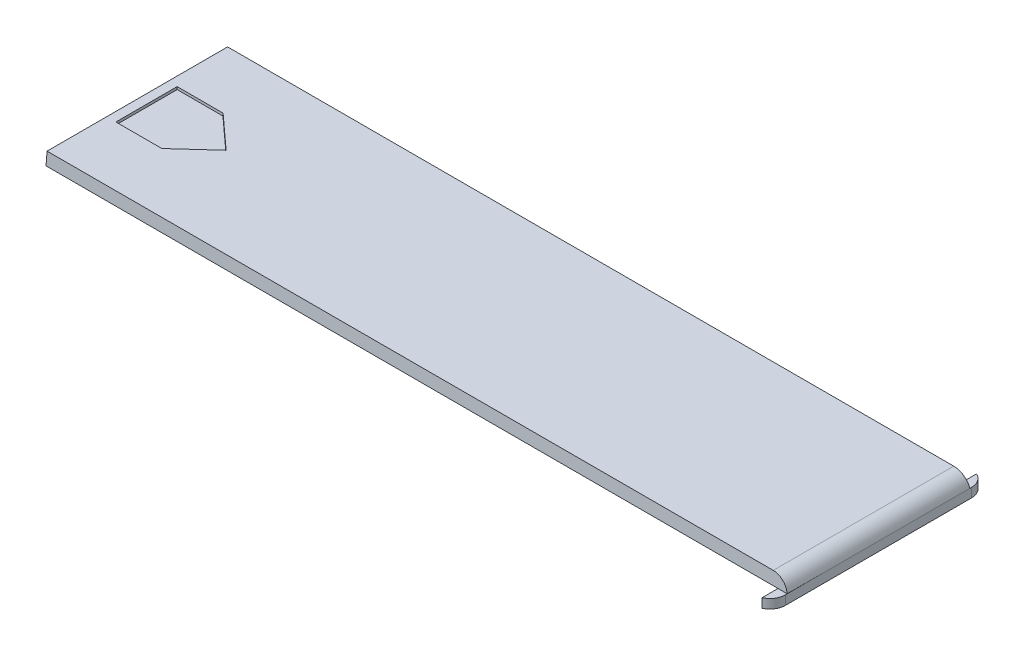
ISO-10303-21;
HEADER;
FILE_DESCRIPTION(('STEP AP214'),'2;1');
FILE_NAME('part.step','',(''),(''),'','','');
FILE_SCHEMA(('AUTOMOTIVE_DESIGN { 1 0 10303 214 1 1 1 1 }'));
ENDSEC;
DATA;
#1=APPLICATION_CONTEXT('core data for automotive mechanical design processes');
#2=APPLICATION_PROTOCOL_DEFINITION('international standard','automotive_design',2000,#1);
#3=PRODUCT_CONTEXT('',#1,'mechanical');
#4=PRODUCT('Part','Part','',(#3));
#5=PRODUCT_RELATED_PRODUCT_CATEGORY('part','',(#4));
#6=PRODUCT_DEFINITION_FORMATION('','',#4);
#7=PRODUCT_DEFINITION_CONTEXT('part definition',#1,'design');
#8=PRODUCT_DEFINITION('design','',#6,#7);
#9=PRODUCT_DEFINITION_SHAPE('','',#8);
#10=(LENGTH_UNIT() NAMED_UNIT(*) SI_UNIT(.MILLI.,.METRE.));
#11=(NAMED_UNIT(*) PLANE_ANGLE_UNIT() SI_UNIT($,.RADIAN.));
#12=(NAMED_UNIT(*) SI_UNIT($,.STERADIAN.) SOLID_ANGLE_UNIT());
#13=UNCERTAINTY_MEASURE_WITH_UNIT(LENGTH_MEASURE(1.E-05),#10,'distance_accuracy_value','');
#14=(GEOMETRIC_REPRESENTATION_CONTEXT(3) GLOBAL_UNCERTAINTY_ASSIGNED_CONTEXT((#13)) GLOBAL_UNIT_ASSIGNED_CONTEXT((#10,
#11,#12)) REPRESENTATION_CONTEXT('',''));
#15=CARTESIAN_POINT('',(0.,0.,0.));
#16=DIRECTION('',(0.,0.,1.));
#17=DIRECTION('',(1.,0.,0.));
#18=AXIS2_PLACEMENT_3D('',#15,#16,#17);
#19=CARTESIAN_POINT('',(0.,0.,0.));
#20=DIRECTION('',(0.,-1.,0.));
#21=DIRECTION('',(0.,0.,-1.));
#22=AXIS2_PLACEMENT_3D('',#19,#20,#21);
#23=PLANE('',#22);
#24=DIRECTION('',(1.,0.,0.));
#25=VECTOR('',#24,1.);
#26=CARTESIAN_POINT('',(-121.75,0.,-11.3497769642847));
#27=LINE('',#26,#25);
#28=CARTESIAN_POINT('',(-121.,0.,-11.3497769642847));
#29=VERTEX_POINT('',#28);
#30=CARTESIAN_POINT('',(-120.25,0.,-11.3497769642847));
#31=VERTEX_POINT('',#30);
#32=EDGE_CURVE('E283',#29,#31,#27,.T.);
#33=ORIENTED_EDGE('',*,*,#32,.T.);
#34=CARTESIAN_POINT('',(-120.25,0.,-12.5997769642847));
#35=DIRECTION('',(0.,1.,0.));
#36=DIRECTION('',(0.,0.,1.));
#37=AXIS2_PLACEMENT_3D('',#34,#35,#36);
#38=CIRCLE('',#37,1.24999999999999);
#39=CARTESIAN_POINT('',(-119.,0.,-12.5997769642847));
#40=VERTEX_POINT('',#39);
#41=EDGE_CURVE('E226',#31,#40,#38,.T.);
#42=ORIENTED_EDGE('',*,*,#41,.T.);
#43=DIRECTION('',(0.,0.,1.));
#44=VECTOR('',#43,1.);
#45=CARTESIAN_POINT('',(-119.,0.,-17.2197769642847));
#46=LINE('',#45,#44);
#47=CARTESIAN_POINT('',(-119.,0.,-17.2197769642847));
#48=VERTEX_POINT('',#47);
#49=EDGE_CURVE('E266',#48,#40,#46,.T.);
#50=ORIENTED_EDGE('',*,*,#49,.F.);
#51=CARTESIAN_POINT('',(-120.25,0.,-17.2197769642847));
#52=DIRECTION('',(0.,1.,0.));
#53=DIRECTION('',(0.,0.,1.));
#54=AXIS2_PLACEMENT_3D('',#51,#52,#53);
#55=CIRCLE('',#54,1.25);
#56=CARTESIAN_POINT('',(-120.25,0.,-18.4697769642847));
#57=VERTEX_POINT('',#56);
#58=EDGE_CURVE('E269',#48,#57,#55,.T.);
#59=ORIENTED_EDGE('',*,*,#58,.T.);
#60=DIRECTION('',(-1.,0.,0.));
#61=VECTOR('',#60,1.);
#62=CARTESIAN_POINT('',(-120.25,0.,-18.4697769642847));
#63=LINE('',#62,#61);
#64=CARTESIAN_POINT('',(-121.,0.,-18.4697769642847));
#65=VERTEX_POINT('',#64);
#66=EDGE_CURVE('E273',#57,#65,#63,.T.);
#67=ORIENTED_EDGE('',*,*,#66,.T.);
#68=DIRECTION('',(0.,0.,1.));
#69=VECTOR('',#68,1.);
#70=CARTESIAN_POINT('',(-121.,0.,-29.8195539285693));
#71=LINE('',#70,#69);
#72=CARTESIAN_POINT('',(-121.,0.,-29.8195539285693));
#73=VERTEX_POINT('',#72);
#74=EDGE_CURVE('E372',#73,#65,#71,.T.);
#75=ORIENTED_EDGE('',*,*,#74,.F.);
#76=DIRECTION('',(1.,0.,0.));
#77=VECTOR('',#76,1.);
#78=CARTESIAN_POINT('',(-121.,0.,-29.8195539285693));
#79=LINE('',#78,#77);
#80=CARTESIAN_POINT('',(-1.5,0.,-29.8195539285693));
#81=VERTEX_POINT('',#80);
#82=EDGE_CURVE('E361',#73,#81,#79,.T.);
#83=ORIENTED_EDGE('',*,*,#82,.T.);
#84=DIRECTION('',(0.,0.,1.));
#85=VECTOR('',#84,1.);
#86=CARTESIAN_POINT('',(-1.5,0.,-32.4097769642847));
#87=LINE('',#86,#85);
#88=CARTESIAN_POINT('',(-1.5,0.,0.));
#89=VERTEX_POINT('',#88);
#90=EDGE_CURVE('E11',#81,#89,#87,.T.);
#91=ORIENTED_EDGE('',*,*,#90,.T.);
#92=DIRECTION('',(1.,0.,0.));
#93=VECTOR('',#92,1.);
#94=CARTESIAN_POINT('',(-121.,0.,0.));
#95=LINE('',#94,#93);
#96=CARTESIAN_POINT('',(-121.,0.,0.));
#97=VERTEX_POINT('',#96);
#98=EDGE_CURVE('E371',#97,#89,#95,.T.);
#99=ORIENTED_EDGE('',*,*,#98,.F.);
#100=EDGE_CURVE('E395',#29,#97,#71,.T.);
#101=ORIENTED_EDGE('',*,*,#100,.F.);
#102=EDGE_LOOP('',(#33,#42,#50,#59,#67,#75,#83,#91,#99,#101));
#103=FACE_BOUND('',#102,.T.);
#104=ADVANCED_FACE('F32',(#103),#23,.T.);
#105=CARTESIAN_POINT('',(-121.,0.,-29.8195539285693));
#106=DIRECTION('',(0.,0.0871557427476584,-0.996194698091746));
#107=DIRECTION('',(0.,0.996194698091746,0.0871557427476584));
#108=AXIS2_PLACEMENT_3D('',#105,#106,#107);
#109=PLANE('',#108);
#110=DIRECTION('',(1.,0.,0.));
#111=VECTOR('',#110,1.);
#112=CARTESIAN_POINT('',(0.,2.,-29.6445766015175));
#113=LINE('',#112,#111);
#114=CARTESIAN_POINT('',(-121.,2.,-29.6445766015175));
#115=VERTEX_POINT('',#114);
#116=CARTESIAN_POINT('',(-2.44948974278318,2.,-29.6445766015175));
#117=VERTEX_POINT('',#116);
#118=EDGE_CURVE('E377',#115,#117,#113,.T.);
#119=ORIENTED_EDGE('',*,*,#118,.T.);
#120=CARTESIAN_POINT('',(-2.44948974278318,-0.5,-29.8632982603323));
#121=DIRECTION('',(0.,0.0871557427476584,-0.996194698091746));
#122=DIRECTION('',(0.,0.996194698091746,0.0871557427476584));
#123=AXIS2_PLACEMENT_3D('',#120,#121,#122);
#124=ELLIPSE('',#123,2.50954959385837,2.5);
#125=CARTESIAN_POINT('',(0.,0.,-29.8195539285693));
#126=VERTEX_POINT('',#125);
#127=EDGE_CURVE('E392',#117,#126,#124,.T.);
#128=ORIENTED_EDGE('',*,*,#127,.T.);
#129=EDGE_CURVE('E359',#81,#126,#79,.T.);
#130=ORIENTED_EDGE('',*,*,#129,.F.);
#131=ORIENTED_EDGE('',*,*,#82,.F.);
#132=DIRECTION('',(0.,-0.996194698091746,-0.0871557427476584));
#133=VECTOR('',#132,1.);
#134=CARTESIAN_POINT('',(-121.,0.,-29.8195539285693));
#135=LINE('',#134,#133);
#136=EDGE_CURVE('E382',#115,#73,#135,.T.);
#137=ORIENTED_EDGE('',*,*,#136,.F.);
#138=EDGE_LOOP('',(#119,#128,#130,#131,#137));
#139=FACE_BOUND('',#138,.T.);
#140=ADVANCED_FACE('F410',(#139),#109,.T.);
#141=CARTESIAN_POINT('',(-121.,2.,-29.8195539285693));
#142=DIRECTION('',(1.,0.,0.));
#143=DIRECTION('',(0.,0.,-1.));
#144=AXIS2_PLACEMENT_3D('',#141,#142,#143);
#145=PLANE('',#144);
#146=ORIENTED_EDGE('',*,*,#74,.T.);
#147=EDGE_CURVE('E565',#65,#29,#71,.T.);
#148=ORIENTED_EDGE('',*,*,#147,.T.);
#149=ORIENTED_EDGE('',*,*,#100,.T.);
#150=DIRECTION('',(0.,0.996194698091746,-0.0871557427476584));
#151=VECTOR('',#150,1.);
#152=CARTESIAN_POINT('',(-121.,0.,0.));
#153=LINE('',#152,#151);
#154=CARTESIAN_POINT('',(-121.,2.,-0.174977327051847));
#155=VERTEX_POINT('',#154);
#156=EDGE_CURVE('E379',#155,#97,#153,.F.);
#157=ORIENTED_EDGE('',*,*,#156,.F.);
#158=DIRECTION('',(0.,0.,1.));
#159=VECTOR('',#158,1.);
#160=CARTESIAN_POINT('',(-121.,2.,-29.8195539285693));
#161=LINE('',#160,#159);
#162=EDGE_CURVE('E386',#115,#155,#161,.T.);
#163=ORIENTED_EDGE('',*,*,#162,.F.);
#164=ORIENTED_EDGE('',*,*,#136,.T.);
#165=EDGE_LOOP('',(#146,#148,#149,#157,#163,#164));
#166=FACE_BOUND('',#165,.T.);
#167=ADVANCED_FACE('F403',(#166),#145,.F.);
#168=CARTESIAN_POINT('',(-121.,0.,0.));
#169=DIRECTION('',(0.,0.0871557427476584,0.996194698091746));
#170=DIRECTION('',(0.,-0.996194698091746,0.0871557427476584));
#171=AXIS2_PLACEMENT_3D('',#168,#169,#170);
#172=PLANE('',#171);
#173=ORIENTED_EDGE('',*,*,#98,.T.);
#174=CARTESIAN_POINT('',(0.,0.,0.));
#175=VERTEX_POINT('',#174);
#176=EDGE_CURVE('E369',#89,#175,#95,.T.);
#177=ORIENTED_EDGE('',*,*,#176,.T.);
#178=CARTESIAN_POINT('',(-2.44948974278318,-0.5,0.0437443317629621));
#179=DIRECTION('',(0.,0.0871557427476584,0.996194698091746));
#180=DIRECTION('',(0.,-0.996194698091746,0.0871557427476584));
#181=AXIS2_PLACEMENT_3D('',#178,#179,#180);
#182=ELLIPSE('',#181,2.50954959385837,2.5);
#183=CARTESIAN_POINT('',(-2.44948974278318,2.,-0.174977327051848));
#184=VERTEX_POINT('',#183);
#185=EDGE_CURVE('E41',#175,#184,#182,.T.);
#186=ORIENTED_EDGE('',*,*,#185,.T.);
#187=DIRECTION('',(-1.,0.,0.));
#188=VECTOR('',#187,1.);
#189=CARTESIAN_POINT('',(0.,2.,-0.174977327051848));
#190=LINE('',#189,#188);
#191=EDGE_CURVE('E383',#155,#184,#190,.F.);
#192=ORIENTED_EDGE('',*,*,#191,.F.);
#193=ORIENTED_EDGE('',*,*,#156,.T.);
#194=EDGE_LOOP('',(#173,#177,#186,#192,#193));
#195=FACE_BOUND('',#194,.T.);
#196=ADVANCED_FACE('F408',(#195),#172,.T.);
#197=CARTESIAN_POINT('',(0.,2.,0.));
#198=DIRECTION('',(0.,-1.,0.));
#199=DIRECTION('',(0.,0.,-1.));
#200=AXIS2_PLACEMENT_3D('',#197,#198,#199);
#201=PLANE('',#200);
#202=DIRECTION('',(-1.,0.,0.));
#203=VECTOR('',#202,1.);
#204=CARTESIAN_POINT('',(-112.,1.99999999999924,-19.9097769642847));
#205=LINE('',#204,#203);
#206=CARTESIAN_POINT('',(-112.,2.,-19.9097769642847));
#207=VERTEX_POINT('',#206);
#208=CARTESIAN_POINT('',(-119.5,1.99999999999924,-19.9097769642847));
#209=VERTEX_POINT('',#208);
#210=EDGE_CURVE('E207',#207,#209,#205,.T.);
#211=ORIENTED_EDGE('',*,*,#210,.F.);
#212=DIRECTION('',(-0.739940073395944,0.,-0.672672793996313));
#213=VECTOR('',#212,1.);
#214=CARTESIAN_POINT('',(-106.5,1.99999999999924,-14.9097769642847));
#215=LINE('',#214,#213);
#216=CARTESIAN_POINT('',(-106.5,1.99999999999924,-14.9097769642847));
#217=VERTEX_POINT('',#216);
#218=EDGE_CURVE('E51',#217,#207,#215,.T.);
#219=ORIENTED_EDGE('',*,*,#218,.F.);
#220=DIRECTION('',(0.739940073395944,0.,-0.672672793996313));
#221=VECTOR('',#220,1.);
#222=CARTESIAN_POINT('',(-112.,1.99999999999924,-9.90977696428465));
#223=LINE('',#222,#221);
#224=CARTESIAN_POINT('',(-112.,1.99999999999924,-9.90977696428465));
#225=VERTEX_POINT('',#224);
#226=EDGE_CURVE('E217',#225,#217,#223,.T.);
#227=ORIENTED_EDGE('',*,*,#226,.F.);
#228=DIRECTION('',(1.,0.,0.));
#229=VECTOR('',#228,1.);
#230=CARTESIAN_POINT('',(-119.5,1.99999999999924,-9.90977696428465));
#231=LINE('',#230,#229);
#232=CARTESIAN_POINT('',(-119.5,1.99999999999924,-9.90977696428465));
#233=VERTEX_POINT('',#232);
#234=EDGE_CURVE('E215',#233,#225,#231,.T.);
#235=ORIENTED_EDGE('',*,*,#234,.F.);
#236=DIRECTION('',(0.,0.,-1.));
#237=VECTOR('',#236,1.);
#238=CARTESIAN_POINT('',(-119.5,1.99999999999924,-9.90977696428465));
#239=LINE('',#238,#237);
#240=EDGE_CURVE('E196',#233,#209,#239,.T.);
#241=ORIENTED_EDGE('',*,*,#240,.T.);
#242=EDGE_LOOP('',(#211,#219,#227,#235,#241));
#243=FACE_BOUND('',#242,.T.);
#244=ORIENTED_EDGE('',*,*,#191,.T.);
#245=DIRECTION('',(0.,0.,1.));
#246=VECTOR('',#245,1.);
#247=CARTESIAN_POINT('',(-2.44948974278318,2.,0.));
#248=LINE('',#247,#246);
#249=EDGE_CURVE('E390',#184,#117,#248,.F.);
#250=ORIENTED_EDGE('',*,*,#249,.T.);
#251=ORIENTED_EDGE('',*,*,#118,.F.);
#252=ORIENTED_EDGE('',*,*,#162,.T.);
#253=EDGE_LOOP('',(#244,#250,#251,#252));
#254=FACE_BOUND('',#253,.T.);
#255=ADVANCED_FACE('F211',(#243,#254),#201,.F.);
#256=CARTESIAN_POINT('',(-2.44948974278318,-0.5,0.));
#257=DIRECTION('',(0.,0.,1.));
#258=DIRECTION('',(1.,0.,0.));
#259=AXIS2_PLACEMENT_3D('',#256,#257,#258);
#260=CYLINDRICAL_SURFACE('',#259,2.5);
#261=ORIENTED_EDGE('',*,*,#185,.F.);
#262=DIRECTION('',(0.,0.,-1.));
#263=VECTOR('',#262,1.);
#264=CARTESIAN_POINT('',(0.,0.,0.));
#265=LINE('',#264,#263);
#266=EDGE_CURVE('E330',#175,#126,#265,.T.);
#267=ORIENTED_EDGE('',*,*,#266,.T.);
#268=ORIENTED_EDGE('',*,*,#127,.F.);
#269=ORIENTED_EDGE('',*,*,#249,.F.);
#270=EDGE_LOOP('',(#261,#267,#268,#269));
#271=FACE_BOUND('',#270,.T.);
#272=ADVANCED_FACE('F34',(#271),#260,.T.);
#273=CARTESIAN_POINT('',(-2.5,0.,-30.1184891168067));
#274=DIRECTION('',(0.,-1.,0.));
#275=DIRECTION('',(0.,0.,-1.));
#276=AXIS2_PLACEMENT_3D('',#273,#274,#275);
#277=PLANE('',#276);
#278=CARTESIAN_POINT('',(-1.5,0.,-32.4097769642847));
#279=VERTEX_POINT('',#278);
#280=EDGE_CURVE('E43',#279,#81,#87,.T.);
#281=ORIENTED_EDGE('',*,*,#280,.T.);
#282=ORIENTED_EDGE('',*,*,#129,.T.);
#283=DIRECTION('',(0.,0.,-1.));
#284=VECTOR('',#283,1.);
#285=CARTESIAN_POINT('',(0.,0.,0.298935188237424));
#286=LINE('',#285,#284);
#287=CARTESIAN_POINT('',(0.,0.,-30.1184891168067));
#288=VERTEX_POINT('',#287);
#289=EDGE_CURVE('E316',#126,#288,#286,.T.);
#290=ORIENTED_EDGE('',*,*,#289,.T.);
#291=CARTESIAN_POINT('',(-2.5,0.,-30.1184891168067));
#292=DIRECTION('',(0.,-1.,0.));
#293=DIRECTION('',(0.,0.,-1.));
#294=AXIS2_PLACEMENT_3D('',#291,#292,#293);
#295=CIRCLE('',#294,2.5);
#296=EDGE_CURVE('E287',#279,#288,#295,.T.);
#297=ORIENTED_EDGE('',*,*,#296,.F.);
#298=EDGE_LOOP('',(#281,#282,#290,#297));
#299=FACE_BOUND('',#298,.T.);
#300=ADVANCED_FACE('F413',(#299),#277,.F.);
#301=CARTESIAN_POINT('',(-2.5,-1.5,-30.1184891168067));
#302=DIRECTION('',(0.,1.,0.));
#303=DIRECTION('',(0.,0.,1.));
#304=AXIS2_PLACEMENT_3D('',#301,#302,#303);
#305=CYLINDRICAL_SURFACE('',#304,2.5);
#306=ORIENTED_EDGE('',*,*,#296,.T.);
#307=DIRECTION('',(0.,1.,0.));
#308=VECTOR('',#307,1.);
#309=CARTESIAN_POINT('',(0.,-1.5,-30.1184891168067));
#310=LINE('',#309,#308);
#311=CARTESIAN_POINT('',(0.,-1.5,-30.1184891168067));
#312=VERTEX_POINT('',#311);
#313=EDGE_CURVE('E327',#312,#288,#310,.T.);
#314=ORIENTED_EDGE('',*,*,#313,.F.);
#315=CARTESIAN_POINT('',(-2.5,-1.5,-30.1184891168067));
#316=DIRECTION('',(0.,-1.,0.));
#317=DIRECTION('',(0.,0.,-1.));
#318=AXIS2_PLACEMENT_3D('',#315,#316,#317);
#319=CIRCLE('',#318,2.5);
#320=CARTESIAN_POINT('',(-1.5,-1.5,-32.4097769642847));
#321=VERTEX_POINT('',#320);
#322=EDGE_CURVE('E303',#321,#312,#319,.T.);
#323=ORIENTED_EDGE('',*,*,#322,.F.);
#324=DIRECTION('',(0.,1.,0.));
#325=VECTOR('',#324,1.);
#326=CARTESIAN_POINT('',(-1.5,-1.5,-32.4097769642847));
#327=LINE('',#326,#325);
#328=EDGE_CURVE('E313',#321,#279,#327,.T.);
#329=ORIENTED_EDGE('',*,*,#328,.T.);
#330=EDGE_LOOP('',(#306,#314,#323,#329));
#331=FACE_BOUND('',#330,.T.);
#332=ADVANCED_FACE('F418',(#331),#305,.T.);
#333=CARTESIAN_POINT('',(0.,-1.5,0.298935188237424));
#334=DIRECTION('',(1.,0.,0.));
#335=DIRECTION('',(0.,0.,-1.));
#336=AXIS2_PLACEMENT_3D('',#333,#334,#335);
#337=PLANE('',#336);
#338=CARTESIAN_POINT('',(0.,0.,0.298935188237424));
#339=VERTEX_POINT('',#338);
#340=EDGE_CURVE('E324',#339,#175,#286,.T.);
#341=ORIENTED_EDGE('',*,*,#340,.F.);
#342=DIRECTION('',(0.,1.,0.));
#343=VECTOR('',#342,1.);
#344=CARTESIAN_POINT('',(0.,-1.5,0.298935188237424));
#345=LINE('',#344,#343);
#346=CARTESIAN_POINT('',(0.,-1.5,0.298935188237424));
#347=VERTEX_POINT('',#346);
#348=EDGE_CURVE('E331',#347,#339,#345,.T.);
#349=ORIENTED_EDGE('',*,*,#348,.F.);
#350=DIRECTION('',(0.,0.,-1.));
#351=VECTOR('',#350,1.);
#352=CARTESIAN_POINT('',(0.,-1.5,0.298935188237424));
#353=LINE('',#352,#351);
#354=EDGE_CURVE('E305',#347,#312,#353,.T.);
#355=ORIENTED_EDGE('',*,*,#354,.T.);
#356=ORIENTED_EDGE('',*,*,#313,.T.);
#357=ORIENTED_EDGE('',*,*,#289,.F.);
#358=ORIENTED_EDGE('',*,*,#266,.F.);
#359=EDGE_LOOP('',(#341,#349,#355,#356,#357,#358));
#360=FACE_BOUND('',#359,.T.);
#361=ADVANCED_FACE('F353',(#360),#337,.T.);
#362=CARTESIAN_POINT('',(-2.50000000000001,-1.5,0.298935188237422));
#363=DIRECTION('',(0.,1.,0.));
#364=DIRECTION('',(0.,0.,1.));
#365=AXIS2_PLACEMENT_3D('',#362,#363,#364);
#366=CYLINDRICAL_SURFACE('',#365,2.5);
#367=CARTESIAN_POINT('',(-2.50000000000001,0.,0.298935188237422));
#368=DIRECTION('',(0.,-1.,0.));
#369=DIRECTION('',(0.,0.,-1.));
#370=AXIS2_PLACEMENT_3D('',#367,#368,#369);
#371=CIRCLE('',#370,2.5);
#372=CARTESIAN_POINT('',(-1.50000000000001,0.,2.59022303571534));
#373=VERTEX_POINT('',#372);
#374=EDGE_CURVE('E319',#339,#373,#371,.T.);
#375=ORIENTED_EDGE('',*,*,#374,.T.);
#376=DIRECTION('',(0.,1.,0.));
#377=VECTOR('',#376,1.);
#378=CARTESIAN_POINT('',(-1.50000000000001,-1.5,2.59022303571534));
#379=LINE('',#378,#377);
#380=CARTESIAN_POINT('',(-1.50000000000001,-1.5,2.59022303571534));
#381=VERTEX_POINT('',#380);
#382=EDGE_CURVE('E333',#381,#373,#379,.T.);
#383=ORIENTED_EDGE('',*,*,#382,.F.);
#384=CARTESIAN_POINT('',(-2.50000000000001,-1.5,0.298935188237422));
#385=DIRECTION('',(0.,-1.,0.));
#386=DIRECTION('',(0.,0.,-1.));
#387=AXIS2_PLACEMENT_3D('',#384,#385,#386);
#388=CIRCLE('',#387,2.5);
#389=EDGE_CURVE('E308',#347,#381,#388,.T.);
#390=ORIENTED_EDGE('',*,*,#389,.F.);
#391=ORIENTED_EDGE('',*,*,#348,.T.);
#392=EDGE_LOOP('',(#375,#383,#390,#391));
#393=FACE_BOUND('',#392,.T.);
#394=ADVANCED_FACE('F347',(#393),#366,.T.);
#395=CARTESIAN_POINT('',(-1.5,-1.5,-32.4097769642847));
#396=DIRECTION('',(-1.,0.,0.));
#397=DIRECTION('',(0.,0.,1.));
#398=AXIS2_PLACEMENT_3D('',#395,#396,#397);
#399=PLANE('',#398);
#400=ORIENTED_EDGE('',*,*,#280,.F.);
#401=ORIENTED_EDGE('',*,*,#328,.F.);
#402=DIRECTION('',(0.,0.,1.));
#403=VECTOR('',#402,1.);
#404=CARTESIAN_POINT('',(-1.5,-1.5,-32.4097769642847));
#405=LINE('',#404,#403);
#406=EDGE_CURVE('E310',#321,#381,#405,.T.);
#407=ORIENTED_EDGE('',*,*,#406,.T.);
#408=ORIENTED_EDGE('',*,*,#382,.T.);
#409=EDGE_CURVE('E44',#89,#373,#87,.T.);
#410=ORIENTED_EDGE('',*,*,#409,.F.);
#411=ORIENTED_EDGE('',*,*,#90,.F.);
#412=EDGE_LOOP('',(#400,#401,#407,#408,#410,#411));
#413=FACE_BOUND('',#412,.T.);
#414=ADVANCED_FACE('F548',(#413),#399,.T.);
#415=CARTESIAN_POINT('',(-2.5,-1.5,-30.1184891168067));
#416=DIRECTION('',(0.,-1.,0.));
#417=DIRECTION('',(0.,0.,-1.));
#418=AXIS2_PLACEMENT_3D('',#415,#416,#417);
#419=PLANE('',#418);
#420=ORIENTED_EDGE('',*,*,#322,.T.);
#421=ORIENTED_EDGE('',*,*,#354,.F.);
#422=ORIENTED_EDGE('',*,*,#389,.T.);
#423=ORIENTED_EDGE('',*,*,#406,.F.);
#424=EDGE_LOOP('',(#420,#421,#422,#423));
#425=FACE_BOUND('',#424,.T.);
#426=ADVANCED_FACE('F546',(#425),#419,.T.);
#427=ORIENTED_EDGE('',*,*,#176,.F.);
#428=ORIENTED_EDGE('',*,*,#409,.T.);
#429=ORIENTED_EDGE('',*,*,#374,.F.);
#430=ORIENTED_EDGE('',*,*,#340,.T.);
#431=EDGE_LOOP('',(#427,#428,#429,#430));
#432=FACE_BOUND('',#431,.T.);
#433=ADVANCED_FACE('F350',(#432),#277,.F.);
#434=CARTESIAN_POINT('',(-120.25,0.,-12.5997769642847));
#435=DIRECTION('',(0.,1.,0.));
#436=DIRECTION('',(0.,0.,1.));
#437=AXIS2_PLACEMENT_3D('',#434,#435,#436);
#438=PLANE('',#437);
#439=ORIENTED_EDGE('',*,*,#147,.F.);
#440=CARTESIAN_POINT('',(-121.75,0.,-18.4697769642847));
#441=VERTEX_POINT('',#440);
#442=EDGE_CURVE('E272',#65,#441,#63,.T.);
#443=ORIENTED_EDGE('',*,*,#442,.T.);
#444=CARTESIAN_POINT('',(-121.75,0.,-17.2197769642847));
#445=DIRECTION('',(0.,-1.,0.));
#446=DIRECTION('',(0.,0.,-1.));
#447=AXIS2_PLACEMENT_3D('',#444,#445,#446);
#448=CIRCLE('',#447,1.25);
#449=CARTESIAN_POINT('',(-123.,0.,-17.2197769642847));
#450=VERTEX_POINT('',#449);
#451=EDGE_CURVE('E276',#450,#441,#448,.T.);
#452=ORIENTED_EDGE('',*,*,#451,.F.);
#453=DIRECTION('',(0.,0.,-1.));
#454=VECTOR('',#453,1.);
#455=CARTESIAN_POINT('',(-123.,0.,-12.5997769642847));
#456=LINE('',#455,#454);
#457=CARTESIAN_POINT('',(-123.,0.,-12.5997769642847));
#458=VERTEX_POINT('',#457);
#459=EDGE_CURVE('E279',#458,#450,#456,.T.);
#460=ORIENTED_EDGE('',*,*,#459,.F.);
#461=CARTESIAN_POINT('',(-121.75,0.,-12.5997769642847));
#462=DIRECTION('',(0.,1.,0.));
#463=DIRECTION('',(0.,0.,1.));
#464=AXIS2_PLACEMENT_3D('',#461,#462,#463);
#465=CIRCLE('',#464,1.25);
#466=CARTESIAN_POINT('',(-121.75,0.,-11.3497769642847));
#467=VERTEX_POINT('',#466);
#468=EDGE_CURVE('E281',#458,#467,#465,.T.);
#469=ORIENTED_EDGE('',*,*,#468,.T.);
#470=EDGE_CURVE('E59',#467,#29,#27,.T.);
#471=ORIENTED_EDGE('',*,*,#470,.T.);
#472=EDGE_LOOP('',(#439,#443,#452,#460,#469,#471));
#473=FACE_BOUND('',#472,.T.);
#474=ADVANCED_FACE('F512',(#473),#438,.T.);
#475=CARTESIAN_POINT('',(-120.25,-2.,-12.5997769642847));
#476=DIRECTION('',(0.,1.,0.));
#477=DIRECTION('',(0.,0.,1.));
#478=AXIS2_PLACEMENT_3D('',#475,#476,#477);
#479=CYLINDRICAL_SURFACE('',#478,1.24999999999999);
#480=ORIENTED_EDGE('',*,*,#41,.F.);
#481=DIRECTION('',(0.,1.,0.));
#482=VECTOR('',#481,1.);
#483=CARTESIAN_POINT('',(-120.25,-2.,-11.3497769642847));
#484=LINE('',#483,#482);
#485=CARTESIAN_POINT('',(-120.25,-2.,-11.3497769642847));
#486=VERTEX_POINT('',#485);
#487=EDGE_CURVE('E285',#486,#31,#484,.T.);
#488=ORIENTED_EDGE('',*,*,#487,.F.);
#489=CARTESIAN_POINT('',(-120.25,-2.,-12.5997769642847));
#490=DIRECTION('',(0.,1.,0.));
#491=DIRECTION('',(0.,0.,1.));
#492=AXIS2_PLACEMENT_3D('',#489,#490,#491);
#493=CIRCLE('',#492,1.24999999999999);
#494=CARTESIAN_POINT('',(-119.,-2.,-12.5997769642847));
#495=VERTEX_POINT('',#494);
#496=EDGE_CURVE('E242',#486,#495,#493,.T.);
#497=ORIENTED_EDGE('',*,*,#496,.T.);
#498=DIRECTION('',(0.,1.,0.));
#499=VECTOR('',#498,1.);
#500=CARTESIAN_POINT('',(-119.,-2.,-12.5997769642847));
#501=LINE('',#500,#499);
#502=EDGE_CURVE('E263',#495,#40,#501,.T.);
#503=ORIENTED_EDGE('',*,*,#502,.T.);
#504=EDGE_LOOP('',(#480,#488,#497,#503));
#505=FACE_BOUND('',#504,.T.);
#506=ADVANCED_FACE('F515',(#505),#479,.T.);
#507=CARTESIAN_POINT('',(-121.75,-2.,-11.3497769642847));
#508=DIRECTION('',(0.,0.,1.));
#509=DIRECTION('',(1.,0.,0.));
#510=AXIS2_PLACEMENT_3D('',#507,#508,#509);
#511=PLANE('',#510);
#512=ORIENTED_EDGE('',*,*,#470,.F.);
#513=DIRECTION('',(0.,1.,0.));
#514=VECTOR('',#513,1.);
#515=CARTESIAN_POINT('',(-121.75,-2.,-11.3497769642847));
#516=LINE('',#515,#514);
#517=CARTESIAN_POINT('',(-121.75,-2.,-11.3497769642847));
#518=VERTEX_POINT('',#517);
#519=EDGE_CURVE('E288',#518,#467,#516,.T.);
#520=ORIENTED_EDGE('',*,*,#519,.F.);
#521=DIRECTION('',(1.,0.,0.));
#522=VECTOR('',#521,1.);
#523=CARTESIAN_POINT('',(-121.75,-2.,-11.3497769642847));
#524=LINE('',#523,#522);
#525=EDGE_CURVE('E260',#518,#486,#524,.T.);
#526=ORIENTED_EDGE('',*,*,#525,.T.);
#527=ORIENTED_EDGE('',*,*,#487,.T.);
#528=ORIENTED_EDGE('',*,*,#32,.F.);
#529=EDGE_LOOP('',(#512,#520,#526,#527,#528));
#530=FACE_BOUND('',#529,.T.);
#531=ADVANCED_FACE('F516',(#530),#511,.T.);
#532=CARTESIAN_POINT('',(-121.75,-2.,-12.5997769642847));
#533=DIRECTION('',(0.,1.,0.));
#534=DIRECTION('',(0.,0.,1.));
#535=AXIS2_PLACEMENT_3D('',#532,#533,#534);
#536=CYLINDRICAL_SURFACE('',#535,1.25);
#537=ORIENTED_EDGE('',*,*,#468,.F.);
#538=DIRECTION('',(0.,1.,0.));
#539=VECTOR('',#538,1.);
#540=CARTESIAN_POINT('',(-123.,-2.,-12.5997769642847));
#541=LINE('',#540,#539);
#542=CARTESIAN_POINT('',(-123.,-2.,-12.5997769642847));
#543=VERTEX_POINT('',#542);
#544=EDGE_CURVE('E290',#543,#458,#541,.T.);
#545=ORIENTED_EDGE('',*,*,#544,.F.);
#546=CARTESIAN_POINT('',(-121.75,-2.,-12.5997769642847));
#547=DIRECTION('',(0.,1.,0.));
#548=DIRECTION('',(0.,0.,1.));
#549=AXIS2_PLACEMENT_3D('',#546,#547,#548);
#550=CIRCLE('',#549,1.25);
#551=EDGE_CURVE('E257',#543,#518,#550,.T.);
#552=ORIENTED_EDGE('',*,*,#551,.T.);
#553=ORIENTED_EDGE('',*,*,#519,.T.);
#554=EDGE_LOOP('',(#537,#545,#552,#553));
#555=FACE_BOUND('',#554,.T.);
#556=ADVANCED_FACE('F519',(#555),#536,.T.);
#557=CARTESIAN_POINT('',(-123.,-2.,-12.5997769642847));
#558=DIRECTION('',(1.,0.,0.));
#559=DIRECTION('',(0.,0.,-1.));
#560=AXIS2_PLACEMENT_3D('',#557,#558,#559);
#561=PLANE('',#560);
#562=ORIENTED_EDGE('',*,*,#459,.T.);
#563=DIRECTION('',(0.,1.,0.));
#564=VECTOR('',#563,1.);
#565=CARTESIAN_POINT('',(-123.,-2.,-17.2197769642847));
#566=LINE('',#565,#564);
#567=CARTESIAN_POINT('',(-123.,-2.,-17.2197769642847));
#568=VERTEX_POINT('',#567);
#569=EDGE_CURVE('E292',#568,#450,#566,.T.);
#570=ORIENTED_EDGE('',*,*,#569,.F.);
#571=DIRECTION('',(0.,0.,-1.));
#572=VECTOR('',#571,1.);
#573=CARTESIAN_POINT('',(-123.,-2.,-12.5997769642847));
#574=LINE('',#573,#572);
#575=EDGE_CURVE('E255',#543,#568,#574,.T.);
#576=ORIENTED_EDGE('',*,*,#575,.F.);
#577=ORIENTED_EDGE('',*,*,#544,.T.);
#578=EDGE_LOOP('',(#562,#570,#576,#577));
#579=FACE_BOUND('',#578,.T.);
#580=ADVANCED_FACE('F523',(#579),#561,.F.);
#581=CARTESIAN_POINT('',(-121.75,-2.,-17.2197769642847));
#582=DIRECTION('',(0.,1.,0.));
#583=DIRECTION('',(0.,0.,1.));
#584=AXIS2_PLACEMENT_3D('',#581,#582,#583);
#585=CYLINDRICAL_SURFACE('',#584,1.25);
#586=ORIENTED_EDGE('',*,*,#451,.T.);
#587=DIRECTION('',(0.,1.,0.));
#588=VECTOR('',#587,1.);
#589=CARTESIAN_POINT('',(-121.75,-2.,-18.4697769642847));
#590=LINE('',#589,#588);
#591=CARTESIAN_POINT('',(-121.75,-2.,-18.4697769642847));
#592=VERTEX_POINT('',#591);
#593=EDGE_CURVE('E295',#592,#441,#590,.T.);
#594=ORIENTED_EDGE('',*,*,#593,.F.);
#595=CARTESIAN_POINT('',(-121.75,-2.,-17.2197769642847));
#596=DIRECTION('',(0.,-1.,0.));
#597=DIRECTION('',(0.,0.,-1.));
#598=AXIS2_PLACEMENT_3D('',#595,#596,#597);
#599=CIRCLE('',#598,1.25);
#600=EDGE_CURVE('E253',#568,#592,#599,.T.);
#601=ORIENTED_EDGE('',*,*,#600,.F.);
#602=ORIENTED_EDGE('',*,*,#569,.T.);
#603=EDGE_LOOP('',(#586,#594,#601,#602));
#604=FACE_BOUND('',#603,.T.);
#605=ADVANCED_FACE('F527',(#604),#585,.T.);
#606=CARTESIAN_POINT('',(-120.25,-2.,-18.4697769642847));
#607=DIRECTION('',(0.,0.,-1.));
#608=DIRECTION('',(-1.,0.,0.));
#609=AXIS2_PLACEMENT_3D('',#606,#607,#608);
#610=PLANE('',#609);
#611=ORIENTED_EDGE('',*,*,#66,.F.);
#612=DIRECTION('',(0.,1.,0.));
#613=VECTOR('',#612,1.);
#614=CARTESIAN_POINT('',(-120.25,-2.,-18.4697769642847));
#615=LINE('',#614,#613);
#616=CARTESIAN_POINT('',(-120.25,-2.,-18.4697769642847));
#617=VERTEX_POINT('',#616);
#618=EDGE_CURVE('E298',#617,#57,#615,.T.);
#619=ORIENTED_EDGE('',*,*,#618,.F.);
#620=DIRECTION('',(-1.,0.,0.));
#621=VECTOR('',#620,1.);
#622=CARTESIAN_POINT('',(-120.25,-2.,-18.4697769642847));
#623=LINE('',#622,#621);
#624=EDGE_CURVE('E250',#617,#592,#623,.T.);
#625=ORIENTED_EDGE('',*,*,#624,.T.);
#626=ORIENTED_EDGE('',*,*,#593,.T.);
#627=ORIENTED_EDGE('',*,*,#442,.F.);
#628=EDGE_LOOP('',(#611,#619,#625,#626,#627));
#629=FACE_BOUND('',#628,.T.);
#630=ADVANCED_FACE('F531',(#629),#610,.T.);
#631=CARTESIAN_POINT('',(-120.25,-2.,-17.2197769642847));
#632=DIRECTION('',(0.,1.,0.));
#633=DIRECTION('',(0.,0.,1.));
#634=AXIS2_PLACEMENT_3D('',#631,#632,#633);
#635=CYLINDRICAL_SURFACE('',#634,1.25);
#636=ORIENTED_EDGE('',*,*,#58,.F.);
#637=DIRECTION('',(0.,1.,0.));
#638=VECTOR('',#637,1.);
#639=CARTESIAN_POINT('',(-119.,-2.,-17.2197769642847));
#640=LINE('',#639,#638);
#641=CARTESIAN_POINT('',(-119.,-2.,-17.2197769642847));
#642=VERTEX_POINT('',#641);
#643=EDGE_CURVE('E300',#642,#48,#640,.T.);
#644=ORIENTED_EDGE('',*,*,#643,.F.);
#645=CARTESIAN_POINT('',(-120.25,-2.,-17.2197769642847));
#646=DIRECTION('',(0.,1.,0.));
#647=DIRECTION('',(0.,0.,1.));
#648=AXIS2_PLACEMENT_3D('',#645,#646,#647);
#649=CIRCLE('',#648,1.25);
#650=EDGE_CURVE('E247',#642,#617,#649,.T.);
#651=ORIENTED_EDGE('',*,*,#650,.T.);
#652=ORIENTED_EDGE('',*,*,#618,.T.);
#653=EDGE_LOOP('',(#636,#644,#651,#652));
#654=FACE_BOUND('',#653,.T.);
#655=ADVANCED_FACE('F535',(#654),#635,.T.);
#656=CARTESIAN_POINT('',(-119.,-2.,-17.2197769642847));
#657=DIRECTION('',(-1.,0.,0.));
#658=DIRECTION('',(0.,0.,1.));
#659=AXIS2_PLACEMENT_3D('',#656,#657,#658);
#660=PLANE('',#659);
#661=ORIENTED_EDGE('',*,*,#49,.T.);
#662=ORIENTED_EDGE('',*,*,#502,.F.);
#663=DIRECTION('',(0.,0.,1.));
#664=VECTOR('',#663,1.);
#665=CARTESIAN_POINT('',(-119.,-2.,-17.2197769642847));
#666=LINE('',#665,#664);
#667=EDGE_CURVE('E245',#642,#495,#666,.T.);
#668=ORIENTED_EDGE('',*,*,#667,.F.);
#669=ORIENTED_EDGE('',*,*,#643,.T.);
#670=EDGE_LOOP('',(#661,#662,#668,#669));
#671=FACE_BOUND('',#670,.T.);
#672=ADVANCED_FACE('F510',(#671),#660,.F.);
#673=CARTESIAN_POINT('',(-120.25,-2.,-12.5997769642847));
#674=DIRECTION('',(0.,1.,0.));
#675=DIRECTION('',(0.,0.,1.));
#676=AXIS2_PLACEMENT_3D('',#673,#674,#675);
#677=PLANE('',#676);
#678=ORIENTED_EDGE('',*,*,#496,.F.);
#679=ORIENTED_EDGE('',*,*,#525,.F.);
#680=ORIENTED_EDGE('',*,*,#551,.F.);
#681=ORIENTED_EDGE('',*,*,#575,.T.);
#682=ORIENTED_EDGE('',*,*,#600,.T.);
#683=ORIENTED_EDGE('',*,*,#624,.F.);
#684=ORIENTED_EDGE('',*,*,#650,.F.);
#685=ORIENTED_EDGE('',*,*,#667,.T.);
#686=EDGE_LOOP('',(#678,#679,#680,#681,#682,#683,#684,#685));
#687=FACE_BOUND('',#686,.T.);
#688=ADVANCED_FACE('F449',(#687),#677,.F.);
#689=CARTESIAN_POINT('',(-106.5,1.99999999999924,-14.9097769642847));
#690=DIRECTION('',(0.671750919310597,-0.0523359562429439,-0.738926011241656));
#691=DIRECTION('',(-0.739940073395943,0.,-0.672672793996313));
#692=AXIS2_PLACEMENT_3D('',#689,#690,#691);
#693=PLANE('',#692);
#694=ORIENTED_EDGE('',*,*,#218,.T.);
#695=DIRECTION('',(0.0202293000449581,0.998425181969767,-0.0523252465673019));
#696=VECTOR('',#695,1.);
#697=CARTESIAN_POINT('',(-112.003041780372,1.84987171505318,-19.9019090742631));
#698=LINE('',#697,#696);
#699=CARTESIAN_POINT('',(-112.008104483104,1.59999999999924,-19.8888138525714));
#700=VERTEX_POINT('',#699);
#701=EDGE_CURVE('E204',#700,#207,#698,.T.);
#702=ORIENTED_EDGE('',*,*,#701,.F.);
#703=DIRECTION('',(-0.739940073395943,0.,-0.672672793996313));
#704=VECTOR('',#703,1.);
#705=CARTESIAN_POINT('',(-106.514101314927,1.59999999999924,-14.894265517865));
#706=LINE('',#705,#704);
#707=CARTESIAN_POINT('',(-106.531163905989,1.59999999999924,-14.9097769642847));
#708=VERTEX_POINT('',#707);
#709=EDGE_CURVE('E223',#708,#700,#706,.T.);
#710=ORIENTED_EDGE('',*,*,#709,.F.);
#711=DIRECTION('',(0.0776743825302575,0.996978781267958,0.));
#712=VECTOR('',#711,1.);
#713=CARTESIAN_POINT('',(-106.533183203358,1.57408158823007,-14.9097769642847));
#714=LINE('',#713,#712);
#715=EDGE_CURVE('E224',#708,#217,#714,.T.);
#716=ORIENTED_EDGE('',*,*,#715,.T.);
#717=EDGE_LOOP('',(#694,#702,#710,#716));
#718=FACE_BOUND('',#717,.T.);
#719=ADVANCED_FACE('F454',(#718),#693,.F.);
#720=CARTESIAN_POINT('',(-112.,1.99999999999924,-9.90977696428465));
#721=DIRECTION('',(0.671750919310597,-0.0523359562429439,0.738926011241656));
#722=DIRECTION('',(0.739940073395943,0.,-0.672672793996313));
#723=AXIS2_PLACEMENT_3D('',#720,#721,#722);
#724=PLANE('',#723);
#725=ORIENTED_EDGE('',*,*,#226,.T.);
#726=ORIENTED_EDGE('',*,*,#715,.F.);
#727=DIRECTION('',(0.739940073395943,0.,-0.672672793996313));
#728=VECTOR('',#727,1.);
#729=CARTESIAN_POINT('',(-112.014101314927,1.59999999999924,-9.92528841070434));
#730=LINE('',#729,#728);
#731=CARTESIAN_POINT('',(-112.008104483104,1.59999999999924,-9.93074007599787));
#732=VERTEX_POINT('',#731);
#733=EDGE_CURVE('E228',#732,#708,#730,.T.);
#734=ORIENTED_EDGE('',*,*,#733,.F.);
#735=DIRECTION('',(0.0202293000449581,0.998425181969767,0.0523252465673019));
#736=VECTOR('',#735,1.);
#737=CARTESIAN_POINT('',(-112.003069184352,1.84851918066043,-9.91771573763017));
#738=LINE('',#737,#736);
#739=EDGE_CURVE('E227',#732,#225,#738,.T.);
#740=ORIENTED_EDGE('',*,*,#739,.T.);
#741=EDGE_LOOP('',(#725,#726,#734,#740));
#742=FACE_BOUND('',#741,.T.);
#743=ADVANCED_FACE('F459',(#742),#724,.F.);
#744=CARTESIAN_POINT('',(-119.5,1.99999999999924,-9.90977696428465));
#745=DIRECTION('',(0.,-0.0523359562429439,0.998629534754574));
#746=DIRECTION('',(0.,-0.998629534754574,-0.052335956242944));
#747=AXIS2_PLACEMENT_3D('',#744,#745,#746);
#748=PLANE('',#747);
#749=ORIENTED_EDGE('',*,*,#234,.T.);
#750=ORIENTED_EDGE('',*,*,#739,.F.);
#751=DIRECTION('',(1.,0.,0.));
#752=VECTOR('',#751,1.);
#753=CARTESIAN_POINT('',(-119.5,1.59999999999924,-9.93074007599787));
#754=LINE('',#753,#752);
#755=CARTESIAN_POINT('',(-119.479036888287,1.59999999999924,-9.93074007599787));
#756=VERTEX_POINT('',#755);
#757=EDGE_CURVE('E237',#756,#732,#754,.T.);
#758=ORIENTED_EDGE('',*,*,#757,.F.);
#759=DIRECTION('',(0.0522644276887141,-0.997264688634237,-0.052264427688714));
#760=VECTOR('',#759,1.);
#761=CARTESIAN_POINT('',(-119.5,1.99999999999924,-9.90977696428465));
#762=LINE('',#761,#760);
#763=EDGE_CURVE('E203',#756,#233,#762,.F.);
#764=ORIENTED_EDGE('',*,*,#763,.T.);
#765=EDGE_LOOP('',(#749,#750,#758,#764));
#766=FACE_BOUND('',#765,.T.);
#767=ADVANCED_FACE('F468',(#766),#748,.F.);
#768=CARTESIAN_POINT('',(-119.5,1.99999999999924,-9.90977696428465));
#769=DIRECTION('',(-0.998629534754574,-0.0523359562429439,0.));
#770=DIRECTION('',(0.052335956242944,-0.998629534754574,0.));
#771=AXIS2_PLACEMENT_3D('',#768,#769,#770);
#772=PLANE('',#771);
#773=ORIENTED_EDGE('',*,*,#240,.F.);
#774=ORIENTED_EDGE('',*,*,#763,.F.);
#775=DIRECTION('',(0.,0.,1.));
#776=VECTOR('',#775,1.);
#777=CARTESIAN_POINT('',(-119.479036888287,1.59999999999924,-9.90977696428465));
#778=LINE('',#777,#776);
#779=CARTESIAN_POINT('',(-119.479036888287,1.59999999999924,-19.8888138525714));
#780=VERTEX_POINT('',#779);
#781=EDGE_CURVE('E199',#756,#780,#778,.F.);
#782=ORIENTED_EDGE('',*,*,#781,.T.);
#783=DIRECTION('',(0.052264427688714,-0.997264688634237,0.052264427688714));
#784=VECTOR('',#783,1.);
#785=CARTESIAN_POINT('',(-119.472684295984,1.47878531794292,-19.8824612602684));
#786=LINE('',#785,#784);
#787=EDGE_CURVE('E192',#780,#209,#786,.F.);
#788=ORIENTED_EDGE('',*,*,#787,.T.);
#789=EDGE_LOOP('',(#773,#774,#782,#788));
#790=FACE_BOUND('',#789,.T.);
#791=ADVANCED_FACE('F194',(#790),#772,.F.);
#792=CARTESIAN_POINT('',(-112.,1.99999999999924,-19.9097769642847));
#793=DIRECTION('',(0.,-0.0523359562429439,-0.998629534754574));
#794=DIRECTION('',(0.,0.998629534754574,-0.052335956242944));
#795=AXIS2_PLACEMENT_3D('',#792,#793,#794);
#796=PLANE('',#795);
#797=ORIENTED_EDGE('',*,*,#210,.T.);
#798=ORIENTED_EDGE('',*,*,#787,.F.);
#799=DIRECTION('',(-1.,0.,0.));
#800=VECTOR('',#799,1.);
#801=CARTESIAN_POINT('',(-112.,1.59999999999924,-19.8888138525714));
#802=LINE('',#801,#800);
#803=EDGE_CURVE('E234',#700,#780,#802,.T.);
#804=ORIENTED_EDGE('',*,*,#803,.F.);
#805=ORIENTED_EDGE('',*,*,#701,.T.);
#806=EDGE_LOOP('',(#797,#798,#804,#805));
#807=FACE_BOUND('',#806,.T.);
#808=ADVANCED_FACE('F208',(#807),#796,.F.);
#809=CARTESIAN_POINT('',(-106.5,1.59999999999924,-14.9097769642847));
#810=DIRECTION('',(0.,-1.,0.));
#811=DIRECTION('',(0.,0.,-1.));
#812=AXIS2_PLACEMENT_3D('',#809,#810,#811);
#813=PLANE('',#812);
#814=ORIENTED_EDGE('',*,*,#709,.T.);
#815=ORIENTED_EDGE('',*,*,#803,.T.);
#816=ORIENTED_EDGE('',*,*,#781,.F.);
#817=ORIENTED_EDGE('',*,*,#757,.T.);
#818=ORIENTED_EDGE('',*,*,#733,.T.);
#819=EDGE_LOOP('',(#814,#815,#816,#817,#818));
#820=FACE_BOUND('',#819,.T.);
#821=ADVANCED_FACE('F495',(#820),#813,.F.);
#822=CLOSED_SHELL('',(#104,#140,#167,#196,#255,#272,#300,#332,#361,#394,#414,#426,#433,#474,
#506,#531,#556,#580,#605,#630,#655,#672,#688,#719,#743,#767,#791,#808,#821));
#823=MANIFOLD_SOLID_BREP('B2',#822);
#824=ADVANCED_BREP_SHAPE_REPRESENTATION('',(#18,#823),#14);
#825=SHAPE_DEFINITION_REPRESENTATION(#9,#824);
ENDSEC;
END-ISO-10303-21;
